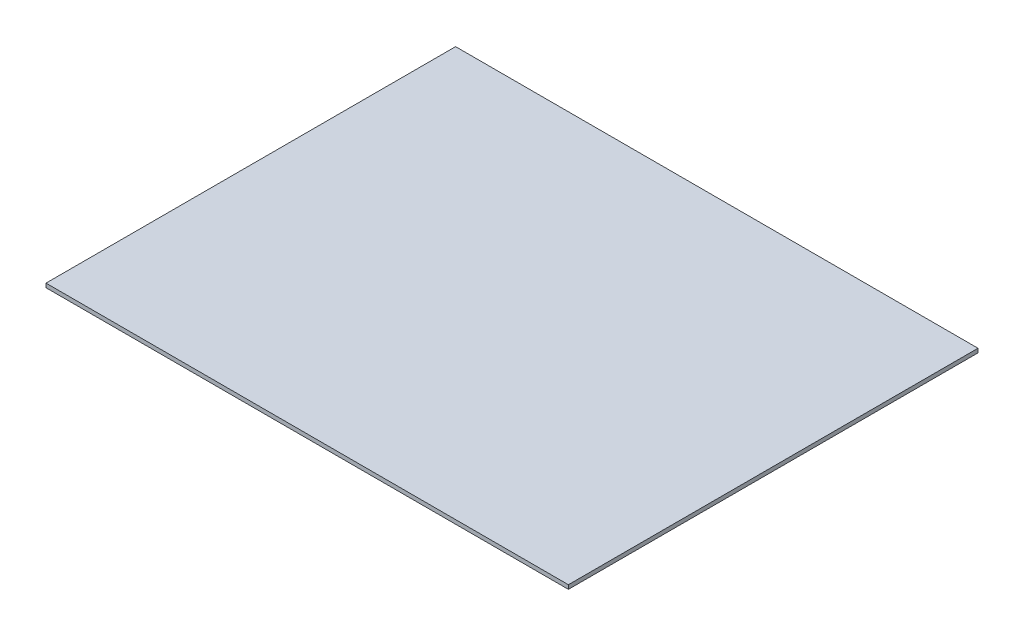
ISO-10303-21;
HEADER;
FILE_DESCRIPTION(('STEP AP214'),'2;1');
FILE_NAME('part.step','',(''),(''),'','','');
FILE_SCHEMA(('AUTOMOTIVE_DESIGN { 1 0 10303 214 1 1 1 1 }'));
ENDSEC;
DATA;
#1=APPLICATION_CONTEXT('core data for automotive mechanical design processes');
#2=APPLICATION_PROTOCOL_DEFINITION('international standard','automotive_design',2000,#1);
#3=PRODUCT_CONTEXT('',#1,'mechanical');
#4=PRODUCT('Part','Part','',(#3));
#5=PRODUCT_RELATED_PRODUCT_CATEGORY('part','',(#4));
#6=PRODUCT_DEFINITION_FORMATION('','',#4);
#7=PRODUCT_DEFINITION_CONTEXT('part definition',#1,'design');
#8=PRODUCT_DEFINITION('design','',#6,#7);
#9=PRODUCT_DEFINITION_SHAPE('','',#8);
#10=(LENGTH_UNIT() NAMED_UNIT(*) SI_UNIT(.MILLI.,.METRE.));
#11=(NAMED_UNIT(*) PLANE_ANGLE_UNIT() SI_UNIT($,.RADIAN.));
#12=(NAMED_UNIT(*) SI_UNIT($,.STERADIAN.) SOLID_ANGLE_UNIT());
#13=UNCERTAINTY_MEASURE_WITH_UNIT(LENGTH_MEASURE(1.E-05),#10,'distance_accuracy_value','');
#14=(GEOMETRIC_REPRESENTATION_CONTEXT(3) GLOBAL_UNCERTAINTY_ASSIGNED_CONTEXT((#13)) GLOBAL_UNIT_ASSIGNED_CONTEXT((#10,
#11,#12)) REPRESENTATION_CONTEXT('',''));
#15=CARTESIAN_POINT('',(0.,0.,0.));
#16=DIRECTION('',(0.,0.,1.));
#17=DIRECTION('',(1.,0.,0.));
#18=AXIS2_PLACEMENT_3D('',#15,#16,#17);
#19=CARTESIAN_POINT('',(194.5,3.,-152.5));
#20=DIRECTION('',(-1.,0.,0.));
#21=DIRECTION('',(0.,0.,1.));
#22=AXIS2_PLACEMENT_3D('',#19,#20,#21);
#23=PLANE('',#22);
#24=DIRECTION('',(0.,0.,-1.));
#25=VECTOR('',#24,1.);
#26=CARTESIAN_POINT('',(194.5,0.,-152.5));
#27=LINE('',#26,#25);
#28=CARTESIAN_POINT('',(194.5,0.,152.5));
#29=VERTEX_POINT('',#28);
#30=CARTESIAN_POINT('',(194.5,0.,-152.5));
#31=VERTEX_POINT('',#30);
#32=EDGE_CURVE('E111',#29,#31,#27,.T.);
#33=ORIENTED_EDGE('',*,*,#32,.T.);
#34=DIRECTION('',(0.,-1.,0.));
#35=VECTOR('',#34,1.);
#36=CARTESIAN_POINT('',(194.5,3.,-152.5));
#37=LINE('',#36,#35);
#38=CARTESIAN_POINT('',(194.5,3.,-152.5));
#39=VERTEX_POINT('',#38);
#40=EDGE_CURVE('E11',#39,#31,#37,.T.);
#41=ORIENTED_EDGE('',*,*,#40,.F.);
#42=DIRECTION('',(0.,0.,-1.));
#43=VECTOR('',#42,1.);
#44=CARTESIAN_POINT('',(194.5,3.,-152.5));
#45=LINE('',#44,#43);
#46=CARTESIAN_POINT('',(194.5,3.,152.5));
#47=VERTEX_POINT('',#46);
#48=EDGE_CURVE('E94',#47,#39,#45,.T.);
#49=ORIENTED_EDGE('',*,*,#48,.F.);
#50=DIRECTION('',(0.,-1.,0.));
#51=VECTOR('',#50,1.);
#52=CARTESIAN_POINT('',(194.5,3.,152.5));
#53=LINE('',#52,#51);
#54=EDGE_CURVE('E107',#47,#29,#53,.T.);
#55=ORIENTED_EDGE('',*,*,#54,.T.);
#56=EDGE_LOOP('',(#33,#41,#49,#55));
#57=FACE_BOUND('',#56,.T.);
#58=ADVANCED_FACE('F42',(#57),#23,.F.);
#59=CARTESIAN_POINT('',(-194.5,3.,-152.5));
#60=DIRECTION('',(0.,0.,1.));
#61=DIRECTION('',(1.,0.,0.));
#62=AXIS2_PLACEMENT_3D('',#59,#60,#61);
#63=PLANE('',#62);
#64=DIRECTION('',(-1.,0.,0.));
#65=VECTOR('',#64,1.);
#66=CARTESIAN_POINT('',(-194.5,0.,-152.5));
#67=LINE('',#66,#65);
#68=CARTESIAN_POINT('',(-194.5,0.,-152.5));
#69=VERTEX_POINT('',#68);
#70=EDGE_CURVE('E99',#31,#69,#67,.T.);
#71=ORIENTED_EDGE('',*,*,#70,.T.);
#72=DIRECTION('',(0.,-1.,0.));
#73=VECTOR('',#72,1.);
#74=CARTESIAN_POINT('',(-194.5,3.,-152.5));
#75=LINE('',#74,#73);
#76=CARTESIAN_POINT('',(-194.5,3.,-152.5));
#77=VERTEX_POINT('',#76);
#78=EDGE_CURVE('E51',#77,#69,#75,.T.);
#79=ORIENTED_EDGE('',*,*,#78,.F.);
#80=DIRECTION('',(-1.,0.,0.));
#81=VECTOR('',#80,1.);
#82=CARTESIAN_POINT('',(-194.5,3.,-152.5));
#83=LINE('',#82,#81);
#84=EDGE_CURVE('E89',#39,#77,#83,.T.);
#85=ORIENTED_EDGE('',*,*,#84,.F.);
#86=ORIENTED_EDGE('',*,*,#40,.T.);
#87=EDGE_LOOP('',(#71,#79,#85,#86));
#88=FACE_BOUND('',#87,.T.);
#89=ADVANCED_FACE('F98',(#88),#63,.F.);
#90=CARTESIAN_POINT('',(-194.5,3.,-152.5));
#91=DIRECTION('',(1.,0.,0.));
#92=DIRECTION('',(0.,0.,-1.));
#93=AXIS2_PLACEMENT_3D('',#90,#91,#92);
#94=PLANE('',#93);
#95=DIRECTION('',(0.,0.,1.));
#96=VECTOR('',#95,1.);
#97=CARTESIAN_POINT('',(-194.5,0.,-152.5));
#98=LINE('',#97,#96);
#99=CARTESIAN_POINT('',(-194.5,0.,152.5));
#100=VERTEX_POINT('',#99);
#101=EDGE_CURVE('E76',#69,#100,#98,.T.);
#102=ORIENTED_EDGE('',*,*,#101,.T.);
#103=DIRECTION('',(0.,-1.,0.));
#104=VECTOR('',#103,1.);
#105=CARTESIAN_POINT('',(-194.5,3.,152.5));
#106=LINE('',#105,#104);
#107=CARTESIAN_POINT('',(-194.5,3.,152.5));
#108=VERTEX_POINT('',#107);
#109=EDGE_CURVE('E101',#108,#100,#106,.T.);
#110=ORIENTED_EDGE('',*,*,#109,.F.);
#111=DIRECTION('',(0.,0.,1.));
#112=VECTOR('',#111,1.);
#113=CARTESIAN_POINT('',(-194.5,3.,-152.5));
#114=LINE('',#113,#112);
#115=EDGE_CURVE('E92',#77,#108,#114,.T.);
#116=ORIENTED_EDGE('',*,*,#115,.F.);
#117=ORIENTED_EDGE('',*,*,#78,.T.);
#118=EDGE_LOOP('',(#102,#110,#116,#117));
#119=FACE_BOUND('',#118,.T.);
#120=ADVANCED_FACE('F102',(#119),#94,.F.);
#121=CARTESIAN_POINT('',(-194.5,3.,152.5));
#122=DIRECTION('',(0.,0.,-1.));
#123=DIRECTION('',(-1.,0.,0.));
#124=AXIS2_PLACEMENT_3D('',#121,#122,#123);
#125=PLANE('',#124);
#126=DIRECTION('',(1.,0.,0.));
#127=VECTOR('',#126,1.);
#128=CARTESIAN_POINT('',(-194.5,0.,152.5));
#129=LINE('',#128,#127);
#130=EDGE_CURVE('E82',#100,#29,#129,.T.);
#131=ORIENTED_EDGE('',*,*,#130,.T.);
#132=ORIENTED_EDGE('',*,*,#54,.F.);
#133=DIRECTION('',(1.,0.,0.));
#134=VECTOR('',#133,1.);
#135=CARTESIAN_POINT('',(-194.5,3.,152.5));
#136=LINE('',#135,#134);
#137=EDGE_CURVE('E59',#108,#47,#136,.T.);
#138=ORIENTED_EDGE('',*,*,#137,.F.);
#139=ORIENTED_EDGE('',*,*,#109,.T.);
#140=EDGE_LOOP('',(#131,#132,#138,#139));
#141=FACE_BOUND('',#140,.T.);
#142=ADVANCED_FACE('F125',(#141),#125,.F.);
#143=CARTESIAN_POINT('',(0.,3.,0.));
#144=DIRECTION('',(0.,1.,0.));
#145=DIRECTION('',(0.,0.,1.));
#146=AXIS2_PLACEMENT_3D('',#143,#144,#145);
#147=PLANE('',#146);
#148=ORIENTED_EDGE('',*,*,#48,.T.);
#149=ORIENTED_EDGE('',*,*,#84,.T.);
#150=ORIENTED_EDGE('',*,*,#115,.T.);
#151=ORIENTED_EDGE('',*,*,#137,.T.);
#152=EDGE_LOOP('',(#148,#149,#150,#151));
#153=FACE_BOUND('',#152,.T.);
#154=ADVANCED_FACE('F90',(#153),#147,.T.);
#155=CARTESIAN_POINT('',(0.,0.,0.));
#156=DIRECTION('',(0.,1.,0.));
#157=DIRECTION('',(0.,0.,1.));
#158=AXIS2_PLACEMENT_3D('',#155,#156,#157);
#159=PLANE('',#158);
#160=ORIENTED_EDGE('',*,*,#32,.F.);
#161=ORIENTED_EDGE('',*,*,#130,.F.);
#162=ORIENTED_EDGE('',*,*,#101,.F.);
#163=ORIENTED_EDGE('',*,*,#70,.F.);
#164=EDGE_LOOP('',(#160,#161,#162,#163));
#165=FACE_BOUND('',#164,.T.);
#166=ADVANCED_FACE('F128',(#165),#159,.F.);
#167=CLOSED_SHELL('',(#58,#89,#120,#142,#154,#166));
#168=MANIFOLD_SOLID_BREP('B2',#167);
#169=ADVANCED_BREP_SHAPE_REPRESENTATION('',(#18,#168),#14);
#170=SHAPE_DEFINITION_REPRESENTATION(#9,#169);
ENDSEC;
END-ISO-10303-21;
